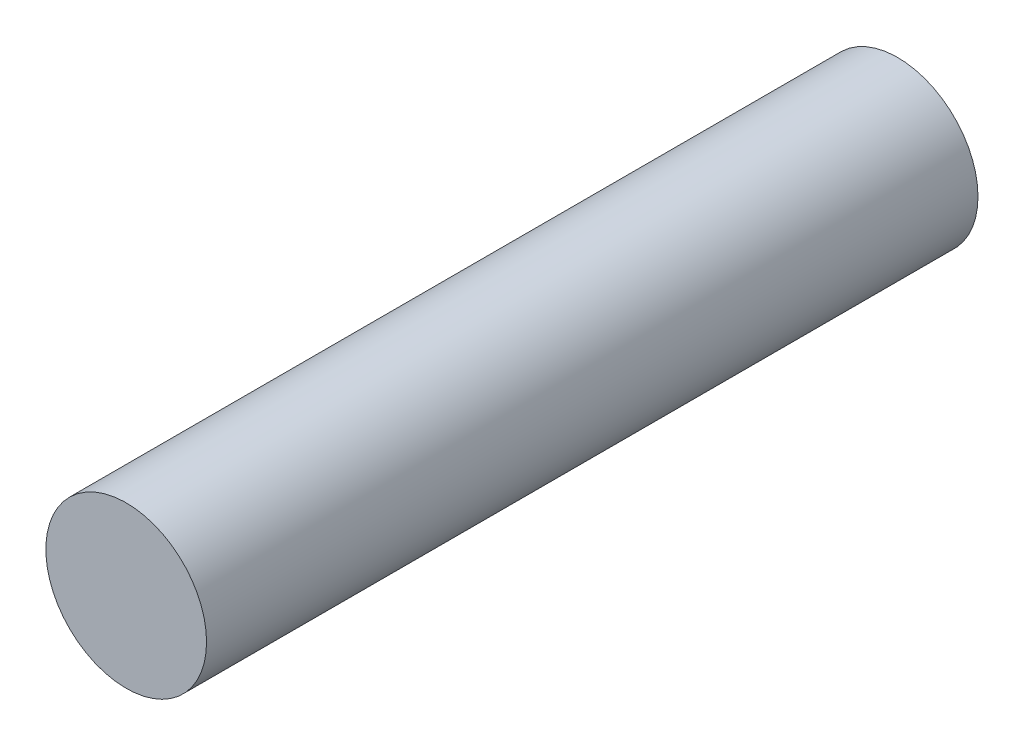
ISO-10303-21;
HEADER;
FILE_DESCRIPTION(('STEP AP214'),'2;1');
FILE_NAME('part.step','',(''),(''),'','','');
FILE_SCHEMA(('AUTOMOTIVE_DESIGN { 1 0 10303 214 1 1 1 1 }'));
ENDSEC;
DATA;
#1=APPLICATION_CONTEXT('core data for automotive mechanical design processes');
#2=APPLICATION_PROTOCOL_DEFINITION('international standard','automotive_design',2000,#1);
#3=PRODUCT_CONTEXT('',#1,'mechanical');
#4=PRODUCT('Part','Part','',(#3));
#5=PRODUCT_RELATED_PRODUCT_CATEGORY('part','',(#4));
#6=PRODUCT_DEFINITION_FORMATION('','',#4);
#7=PRODUCT_DEFINITION_CONTEXT('part definition',#1,'design');
#8=PRODUCT_DEFINITION('design','',#6,#7);
#9=PRODUCT_DEFINITION_SHAPE('','',#8);
#10=(LENGTH_UNIT() NAMED_UNIT(*) SI_UNIT(.MILLI.,.METRE.));
#11=(NAMED_UNIT(*) PLANE_ANGLE_UNIT() SI_UNIT($,.RADIAN.));
#12=(NAMED_UNIT(*) SI_UNIT($,.STERADIAN.) SOLID_ANGLE_UNIT());
#13=UNCERTAINTY_MEASURE_WITH_UNIT(LENGTH_MEASURE(1.E-05),#10,'distance_accuracy_value','');
#14=(GEOMETRIC_REPRESENTATION_CONTEXT(3) GLOBAL_UNCERTAINTY_ASSIGNED_CONTEXT((#13)) GLOBAL_UNIT_ASSIGNED_CONTEXT((#10,
#11,#12)) REPRESENTATION_CONTEXT('',''));
#15=CARTESIAN_POINT('',(0.,0.,0.));
#16=DIRECTION('',(0.,0.,1.));
#17=DIRECTION('',(1.,0.,0.));
#18=AXIS2_PLACEMENT_3D('',#15,#16,#17);
#19=CARTESIAN_POINT('',(0.,0.,48.));
#20=DIRECTION('',(0.,0.,-1.));
#21=DIRECTION('',(-1.,0.,0.));
#22=AXIS2_PLACEMENT_3D('',#19,#20,#21);
#23=CYLINDRICAL_SURFACE('',#22,5.);
#24=CARTESIAN_POINT('',(0.,0.,48.));
#25=DIRECTION('',(0.,0.,1.));
#26=DIRECTION('',(1.,0.,0.));
#27=AXIS2_PLACEMENT_3D('',#24,#25,#26);
#28=CIRCLE('',#27,5.);
#29=CARTESIAN_POINT('',(5.,0.,48.));
#30=VERTEX_POINT('',#29);
#31=EDGE_CURVE('E10',#30,#30,#28,.T.);
#32=ORIENTED_EDGE('',*,*,#31,.F.);
#33=EDGE_LOOP('',(#32));
#34=FACE_BOUND('',#33,.T.);
#35=CARTESIAN_POINT('',(0.,0.,0.));
#36=DIRECTION('',(0.,0.,1.));
#37=DIRECTION('',(1.,0.,0.));
#38=AXIS2_PLACEMENT_3D('',#35,#36,#37);
#39=CIRCLE('',#38,5.);
#40=CARTESIAN_POINT('',(5.,0.,0.));
#41=VERTEX_POINT('',#40);
#42=EDGE_CURVE('E40',#41,#41,#39,.T.);
#43=ORIENTED_EDGE('',*,*,#42,.T.);
#44=EDGE_LOOP('',(#43));
#45=FACE_BOUND('',#44,.T.);
#46=ADVANCED_FACE('F37',(#34,#45),#23,.T.);
#47=CARTESIAN_POINT('',(0.,0.,48.));
#48=DIRECTION('',(0.,0.,1.));
#49=DIRECTION('',(1.,0.,0.));
#50=AXIS2_PLACEMENT_3D('',#47,#48,#49);
#51=PLANE('',#50);
#52=ORIENTED_EDGE('',*,*,#31,.T.);
#53=EDGE_LOOP('',(#52));
#54=FACE_BOUND('',#53,.T.);
#55=ADVANCED_FACE('F52',(#54),#51,.T.);
#56=CARTESIAN_POINT('',(0.,0.,0.));
#57=DIRECTION('',(0.,0.,1.));
#58=DIRECTION('',(1.,0.,0.));
#59=AXIS2_PLACEMENT_3D('',#56,#57,#58);
#60=PLANE('',#59);
#61=ORIENTED_EDGE('',*,*,#42,.F.);
#62=EDGE_LOOP('',(#61));
#63=FACE_BOUND('',#62,.T.);
#64=ADVANCED_FACE('F50',(#63),#60,.F.);
#65=CLOSED_SHELL('',(#46,#55,#64));
#66=MANIFOLD_SOLID_BREP('B2',#65);
#67=ADVANCED_BREP_SHAPE_REPRESENTATION('',(#18,#66),#14);
#68=SHAPE_DEFINITION_REPRESENTATION(#9,#67);
ENDSEC;
END-ISO-10303-21;
